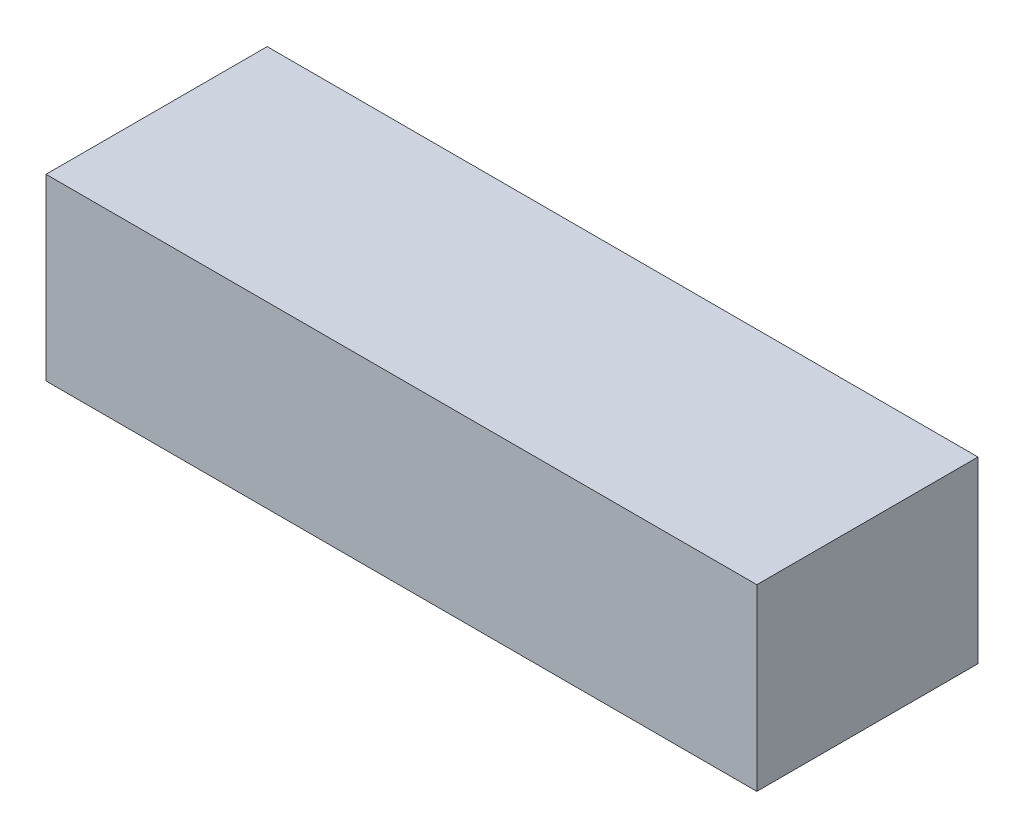
ISO-10303-21;
HEADER;
FILE_DESCRIPTION(('STEP AP214'),'2;1');
FILE_NAME('part.step','',(''),(''),'','','');
FILE_SCHEMA(('AUTOMOTIVE_DESIGN { 1 0 10303 214 1 1 1 1 }'));
ENDSEC;
DATA;
#1=APPLICATION_CONTEXT('core data for automotive mechanical design processes');
#2=APPLICATION_PROTOCOL_DEFINITION('international standard','automotive_design',2000,#1);
#3=PRODUCT_CONTEXT('',#1,'mechanical');
#4=PRODUCT('Part','Part','',(#3));
#5=PRODUCT_RELATED_PRODUCT_CATEGORY('part','',(#4));
#6=PRODUCT_DEFINITION_FORMATION('','',#4);
#7=PRODUCT_DEFINITION_CONTEXT('part definition',#1,'design');
#8=PRODUCT_DEFINITION('design','',#6,#7);
#9=PRODUCT_DEFINITION_SHAPE('','',#8);
#10=(LENGTH_UNIT() NAMED_UNIT(*) SI_UNIT(.MILLI.,.METRE.));
#11=(NAMED_UNIT(*) PLANE_ANGLE_UNIT() SI_UNIT($,.RADIAN.));
#12=(NAMED_UNIT(*) SI_UNIT($,.STERADIAN.) SOLID_ANGLE_UNIT());
#13=UNCERTAINTY_MEASURE_WITH_UNIT(LENGTH_MEASURE(1.E-05),#10,'distance_accuracy_value','');
#14=(GEOMETRIC_REPRESENTATION_CONTEXT(3) GLOBAL_UNCERTAINTY_ASSIGNED_CONTEXT((#13)) GLOBAL_UNIT_ASSIGNED_CONTEXT((#10,
#11,#12)) REPRESENTATION_CONTEXT('',''));
#15=CARTESIAN_POINT('',(0.,0.,0.));
#16=DIRECTION('',(0.,0.,1.));
#17=DIRECTION('',(1.,0.,0.));
#18=AXIS2_PLACEMENT_3D('',#15,#16,#17);
#19=CARTESIAN_POINT('',(67.5,34.,-21.));
#20=DIRECTION('',(-1.,0.,0.));
#21=DIRECTION('',(0.,0.,1.));
#22=AXIS2_PLACEMENT_3D('',#19,#20,#21);
#23=PLANE('',#22);
#24=DIRECTION('',(0.,0.,-1.));
#25=VECTOR('',#24,1.);
#26=CARTESIAN_POINT('',(67.5,0.,-21.));
#27=LINE('',#26,#25);
#28=CARTESIAN_POINT('',(67.5,0.,21.));
#29=VERTEX_POINT('',#28);
#30=CARTESIAN_POINT('',(67.5,0.,-21.));
#31=VERTEX_POINT('',#30);
#32=EDGE_CURVE('E111',#29,#31,#27,.T.);
#33=ORIENTED_EDGE('',*,*,#32,.T.);
#34=DIRECTION('',(0.,-1.,0.));
#35=VECTOR('',#34,1.);
#36=CARTESIAN_POINT('',(67.5,34.,-21.));
#37=LINE('',#36,#35);
#38=CARTESIAN_POINT('',(67.5,34.,-21.));
#39=VERTEX_POINT('',#38);
#40=EDGE_CURVE('E11',#39,#31,#37,.T.);
#41=ORIENTED_EDGE('',*,*,#40,.F.);
#42=DIRECTION('',(0.,0.,-1.));
#43=VECTOR('',#42,1.);
#44=CARTESIAN_POINT('',(67.5,34.,-21.));
#45=LINE('',#44,#43);
#46=CARTESIAN_POINT('',(67.5,34.,21.));
#47=VERTEX_POINT('',#46);
#48=EDGE_CURVE('E95',#47,#39,#45,.T.);
#49=ORIENTED_EDGE('',*,*,#48,.F.);
#50=DIRECTION('',(0.,-1.,0.));
#51=VECTOR('',#50,1.);
#52=CARTESIAN_POINT('',(67.5,34.,21.));
#53=LINE('',#52,#51);
#54=EDGE_CURVE('E107',#47,#29,#53,.T.);
#55=ORIENTED_EDGE('',*,*,#54,.T.);
#56=EDGE_LOOP('',(#33,#41,#49,#55));
#57=FACE_BOUND('',#56,.T.);
#58=ADVANCED_FACE('F43',(#57),#23,.F.);
#59=CARTESIAN_POINT('',(-67.5,34.,-21.));
#60=DIRECTION('',(0.,0.,1.));
#61=DIRECTION('',(1.,0.,0.));
#62=AXIS2_PLACEMENT_3D('',#59,#60,#61);
#63=PLANE('',#62);
#64=DIRECTION('',(-1.,0.,0.));
#65=VECTOR('',#64,1.);
#66=CARTESIAN_POINT('',(-67.5,0.,-21.));
#67=LINE('',#66,#65);
#68=CARTESIAN_POINT('',(-67.5,0.,-21.));
#69=VERTEX_POINT('',#68);
#70=EDGE_CURVE('E100',#31,#69,#67,.T.);
#71=ORIENTED_EDGE('',*,*,#70,.T.);
#72=DIRECTION('',(0.,-1.,0.));
#73=VECTOR('',#72,1.);
#74=CARTESIAN_POINT('',(-67.5,34.,-21.));
#75=LINE('',#74,#73);
#76=CARTESIAN_POINT('',(-67.5,34.,-21.));
#77=VERTEX_POINT('',#76);
#78=EDGE_CURVE('E52',#77,#69,#75,.T.);
#79=ORIENTED_EDGE('',*,*,#78,.F.);
#80=DIRECTION('',(-1.,0.,0.));
#81=VECTOR('',#80,1.);
#82=CARTESIAN_POINT('',(-67.5,34.,-21.));
#83=LINE('',#82,#81);
#84=EDGE_CURVE('E90',#39,#77,#83,.T.);
#85=ORIENTED_EDGE('',*,*,#84,.F.);
#86=ORIENTED_EDGE('',*,*,#40,.T.);
#87=EDGE_LOOP('',(#71,#79,#85,#86));
#88=FACE_BOUND('',#87,.T.);
#89=ADVANCED_FACE('F99',(#88),#63,.F.);
#90=CARTESIAN_POINT('',(-67.5,34.,-21.));
#91=DIRECTION('',(1.,0.,0.));
#92=DIRECTION('',(0.,0.,-1.));
#93=AXIS2_PLACEMENT_3D('',#90,#91,#92);
#94=PLANE('',#93);
#95=DIRECTION('',(0.,0.,1.));
#96=VECTOR('',#95,1.);
#97=CARTESIAN_POINT('',(-67.5,0.,-21.));
#98=LINE('',#97,#96);
#99=CARTESIAN_POINT('',(-67.5,0.,21.));
#100=VERTEX_POINT('',#99);
#101=EDGE_CURVE('E77',#69,#100,#98,.T.);
#102=ORIENTED_EDGE('',*,*,#101,.T.);
#103=DIRECTION('',(0.,-1.,0.));
#104=VECTOR('',#103,1.);
#105=CARTESIAN_POINT('',(-67.5,34.,21.));
#106=LINE('',#105,#104);
#107=CARTESIAN_POINT('',(-67.5,34.,21.));
#108=VERTEX_POINT('',#107);
#109=EDGE_CURVE('E102',#108,#100,#106,.T.);
#110=ORIENTED_EDGE('',*,*,#109,.F.);
#111=DIRECTION('',(0.,0.,1.));
#112=VECTOR('',#111,1.);
#113=CARTESIAN_POINT('',(-67.5,34.,-21.));
#114=LINE('',#113,#112);
#115=EDGE_CURVE('E93',#77,#108,#114,.T.);
#116=ORIENTED_EDGE('',*,*,#115,.F.);
#117=ORIENTED_EDGE('',*,*,#78,.T.);
#118=EDGE_LOOP('',(#102,#110,#116,#117));
#119=FACE_BOUND('',#118,.T.);
#120=ADVANCED_FACE('F103',(#119),#94,.F.);
#121=CARTESIAN_POINT('',(-67.5,34.,21.));
#122=DIRECTION('',(0.,0.,-1.));
#123=DIRECTION('',(-1.,0.,0.));
#124=AXIS2_PLACEMENT_3D('',#121,#122,#123);
#125=PLANE('',#124);
#126=DIRECTION('',(1.,0.,0.));
#127=VECTOR('',#126,1.);
#128=CARTESIAN_POINT('',(-67.5,0.,21.));
#129=LINE('',#128,#127);
#130=EDGE_CURVE('E83',#100,#29,#129,.T.);
#131=ORIENTED_EDGE('',*,*,#130,.T.);
#132=ORIENTED_EDGE('',*,*,#54,.F.);
#133=DIRECTION('',(1.,0.,0.));
#134=VECTOR('',#133,1.);
#135=CARTESIAN_POINT('',(-67.5,34.,21.));
#136=LINE('',#135,#134);
#137=EDGE_CURVE('E60',#108,#47,#136,.T.);
#138=ORIENTED_EDGE('',*,*,#137,.F.);
#139=ORIENTED_EDGE('',*,*,#109,.T.);
#140=EDGE_LOOP('',(#131,#132,#138,#139));
#141=FACE_BOUND('',#140,.T.);
#142=ADVANCED_FACE('F124',(#141),#125,.F.);
#143=CARTESIAN_POINT('',(0.,34.,0.));
#144=DIRECTION('',(0.,1.,0.));
#145=DIRECTION('',(0.,0.,1.));
#146=AXIS2_PLACEMENT_3D('',#143,#144,#145);
#147=PLANE('',#146);
#148=ORIENTED_EDGE('',*,*,#48,.T.);
#149=ORIENTED_EDGE('',*,*,#84,.T.);
#150=ORIENTED_EDGE('',*,*,#115,.T.);
#151=ORIENTED_EDGE('',*,*,#137,.T.);
#152=EDGE_LOOP('',(#148,#149,#150,#151));
#153=FACE_BOUND('',#152,.T.);
#154=ADVANCED_FACE('F91',(#153),#147,.T.);
#155=CARTESIAN_POINT('',(0.,0.,0.));
#156=DIRECTION('',(0.,1.,0.));
#157=DIRECTION('',(0.,0.,1.));
#158=AXIS2_PLACEMENT_3D('',#155,#156,#157);
#159=PLANE('',#158);
#160=ORIENTED_EDGE('',*,*,#32,.F.);
#161=ORIENTED_EDGE('',*,*,#130,.F.);
#162=ORIENTED_EDGE('',*,*,#101,.F.);
#163=ORIENTED_EDGE('',*,*,#70,.F.);
#164=EDGE_LOOP('',(#160,#161,#162,#163));
#165=FACE_BOUND('',#164,.T.);
#166=ADVANCED_FACE('F127',(#165),#159,.F.);
#167=CLOSED_SHELL('',(#58,#89,#120,#142,#154,#166));
#168=MANIFOLD_SOLID_BREP('B2',#167);
#169=ADVANCED_BREP_SHAPE_REPRESENTATION('',(#18,#168),#14);
#170=SHAPE_DEFINITION_REPRESENTATION(#9,#169);
ENDSEC;
END-ISO-10303-21;
